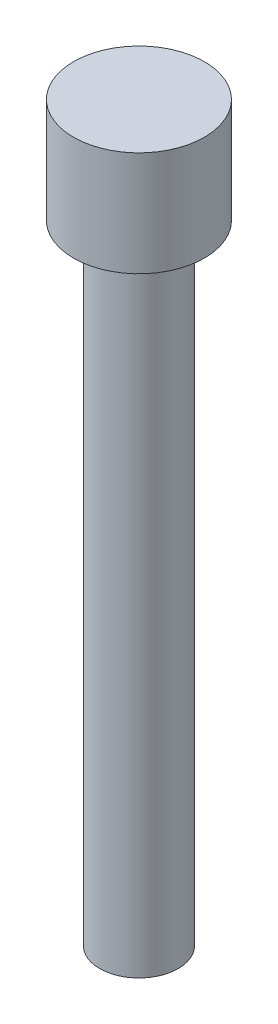
ISO-10303-21;
HEADER;
FILE_DESCRIPTION(('STEP AP214'),'2;1');
FILE_NAME('part.step','',(''),(''),'','','');
FILE_SCHEMA(('AUTOMOTIVE_DESIGN { 1 0 10303 214 1 1 1 1 }'));
ENDSEC;
DATA;
#1=APPLICATION_CONTEXT('core data for automotive mechanical design processes');
#2=APPLICATION_PROTOCOL_DEFINITION('international standard','automotive_design',2000,#1);
#3=PRODUCT_CONTEXT('',#1,'mechanical');
#4=PRODUCT('Part','Part','',(#3));
#5=PRODUCT_RELATED_PRODUCT_CATEGORY('part','',(#4));
#6=PRODUCT_DEFINITION_FORMATION('','',#4);
#7=PRODUCT_DEFINITION_CONTEXT('part definition',#1,'design');
#8=PRODUCT_DEFINITION('design','',#6,#7);
#9=PRODUCT_DEFINITION_SHAPE('','',#8);
#10=(LENGTH_UNIT() NAMED_UNIT(*) SI_UNIT(.MILLI.,.METRE.));
#11=(NAMED_UNIT(*) PLANE_ANGLE_UNIT() SI_UNIT($,.RADIAN.));
#12=(NAMED_UNIT(*) SI_UNIT($,.STERADIAN.) SOLID_ANGLE_UNIT());
#13=UNCERTAINTY_MEASURE_WITH_UNIT(LENGTH_MEASURE(1.E-05),#10,'distance_accuracy_value','');
#14=(GEOMETRIC_REPRESENTATION_CONTEXT(3) GLOBAL_UNCERTAINTY_ASSIGNED_CONTEXT((#13)) GLOBAL_UNIT_ASSIGNED_CONTEXT((#10,
#11,#12)) REPRESENTATION_CONTEXT('',''));
#15=CARTESIAN_POINT('',(0.,0.,0.));
#16=DIRECTION('',(0.,0.,1.));
#17=DIRECTION('',(1.,0.,0.));
#18=AXIS2_PLACEMENT_3D('',#15,#16,#17);
#19=CARTESIAN_POINT('',(0.,24.,0.));
#20=DIRECTION('',(0.,-1.,0.));
#21=DIRECTION('',(0.,0.,-1.));
#22=AXIS2_PLACEMENT_3D('',#19,#20,#21);
#23=CYLINDRICAL_SURFACE('',#22,1.5);
#24=CARTESIAN_POINT('',(0.,24.,0.));
#25=DIRECTION('',(0.,1.,0.));
#26=DIRECTION('',(0.,0.,1.));
#27=AXIS2_PLACEMENT_3D('',#24,#25,#26);
#28=CIRCLE('',#27,1.5);
#29=CARTESIAN_POINT('',(0.,24.,1.5));
#30=VERTEX_POINT('',#29);
#31=EDGE_CURVE('E10',#30,#30,#28,.T.);
#32=ORIENTED_EDGE('',*,*,#31,.F.);
#33=EDGE_LOOP('',(#32));
#34=FACE_BOUND('',#33,.T.);
#35=CARTESIAN_POINT('',(0.,0.,0.));
#36=DIRECTION('',(0.,1.,0.));
#37=DIRECTION('',(0.,0.,1.));
#38=AXIS2_PLACEMENT_3D('',#35,#36,#37);
#39=CIRCLE('',#38,1.5);
#40=CARTESIAN_POINT('',(0.,0.,1.5));
#41=VERTEX_POINT('',#40);
#42=EDGE_CURVE('E34',#41,#41,#39,.T.);
#43=ORIENTED_EDGE('',*,*,#42,.T.);
#44=EDGE_LOOP('',(#43));
#45=FACE_BOUND('',#44,.T.);
#46=ADVANCED_FACE('F31',(#34,#45),#23,.T.);
#47=CARTESIAN_POINT('',(0.,0.,0.));
#48=DIRECTION('',(0.,1.,0.));
#49=DIRECTION('',(0.,0.,1.));
#50=AXIS2_PLACEMENT_3D('',#47,#48,#49);
#51=PLANE('',#50);
#52=ORIENTED_EDGE('',*,*,#42,.F.);
#53=EDGE_LOOP('',(#52));
#54=FACE_BOUND('',#53,.T.);
#55=ADVANCED_FACE('F54',(#54),#51,.F.);
#56=CARTESIAN_POINT('',(0.,28.,0.));
#57=DIRECTION('',(0.,-1.,0.));
#58=DIRECTION('',(0.,0.,-1.));
#59=AXIS2_PLACEMENT_3D('',#56,#57,#58);
#60=CYLINDRICAL_SURFACE('',#59,2.5);
#61=CARTESIAN_POINT('',(0.,28.,0.));
#62=DIRECTION('',(0.,1.,0.));
#63=DIRECTION('',(0.,0.,1.));
#64=AXIS2_PLACEMENT_3D('',#61,#62,#63);
#65=CIRCLE('',#64,2.5);
#66=CARTESIAN_POINT('',(0.,28.,2.5));
#67=VERTEX_POINT('',#66);
#68=EDGE_CURVE('E41',#67,#67,#65,.T.);
#69=ORIENTED_EDGE('',*,*,#68,.F.);
#70=EDGE_LOOP('',(#69));
#71=FACE_BOUND('',#70,.T.);
#72=CARTESIAN_POINT('',(0.,24.,0.));
#73=DIRECTION('',(0.,1.,0.));
#74=DIRECTION('',(0.,0.,1.));
#75=AXIS2_PLACEMENT_3D('',#72,#73,#74);
#76=CIRCLE('',#75,2.5);
#77=CARTESIAN_POINT('',(0.,24.,2.5));
#78=VERTEX_POINT('',#77);
#79=EDGE_CURVE('E43',#78,#78,#76,.T.);
#80=ORIENTED_EDGE('',*,*,#79,.T.);
#81=EDGE_LOOP('',(#80));
#82=FACE_BOUND('',#81,.T.);
#83=ADVANCED_FACE('F51',(#71,#82),#60,.T.);
#84=CARTESIAN_POINT('',(0.,28.,0.));
#85=DIRECTION('',(0.,1.,0.));
#86=DIRECTION('',(0.,0.,1.));
#87=AXIS2_PLACEMENT_3D('',#84,#85,#86);
#88=PLANE('',#87);
#89=ORIENTED_EDGE('',*,*,#68,.T.);
#90=EDGE_LOOP('',(#89));
#91=FACE_BOUND('',#90,.T.);
#92=ADVANCED_FACE('F49',(#91),#88,.T.);
#93=CARTESIAN_POINT('',(0.,24.,0.));
#94=DIRECTION('',(0.,1.,0.));
#95=DIRECTION('',(0.,0.,1.));
#96=AXIS2_PLACEMENT_3D('',#93,#94,#95);
#97=PLANE('',#96);
#98=ORIENTED_EDGE('',*,*,#31,.T.);
#99=EDGE_LOOP('',(#98));
#100=FACE_BOUND('',#99,.T.);
#101=ORIENTED_EDGE('',*,*,#79,.F.);
#102=EDGE_LOOP('',(#101));
#103=FACE_BOUND('',#102,.T.);
#104=ADVANCED_FACE('F58',(#100,#103),#97,.F.);
#105=CLOSED_SHELL('',(#46,#55,#83,#92,#104));
#106=MANIFOLD_SOLID_BREP('B2',#105);
#107=ADVANCED_BREP_SHAPE_REPRESENTATION('',(#18,#106),#14);
#108=SHAPE_DEFINITION_REPRESENTATION(#9,#107);
ENDSEC;
END-ISO-10303-21;
